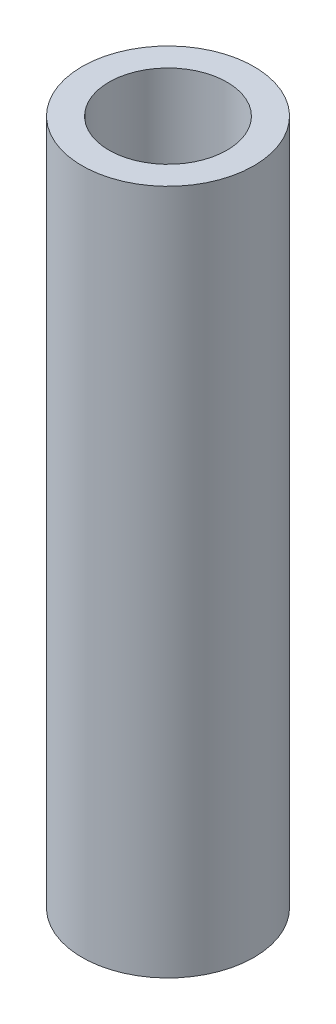
ISO-10303-21;
HEADER;
FILE_DESCRIPTION(('STEP AP214'),'2;1');
FILE_NAME('part.step','',(''),(''),'','','');
FILE_SCHEMA(('AUTOMOTIVE_DESIGN { 1 0 10303 214 1 1 1 1 }'));
ENDSEC;
DATA;
#1=APPLICATION_CONTEXT('core data for automotive mechanical design processes');
#2=APPLICATION_PROTOCOL_DEFINITION('international standard','automotive_design',2000,#1);
#3=PRODUCT_CONTEXT('',#1,'mechanical');
#4=PRODUCT('Part','Part','',(#3));
#5=PRODUCT_RELATED_PRODUCT_CATEGORY('part','',(#4));
#6=PRODUCT_DEFINITION_FORMATION('','',#4);
#7=PRODUCT_DEFINITION_CONTEXT('part definition',#1,'design');
#8=PRODUCT_DEFINITION('design','',#6,#7);
#9=PRODUCT_DEFINITION_SHAPE('','',#8);
#10=(LENGTH_UNIT() NAMED_UNIT(*) SI_UNIT(.MILLI.,.METRE.));
#11=(NAMED_UNIT(*) PLANE_ANGLE_UNIT() SI_UNIT($,.RADIAN.));
#12=(NAMED_UNIT(*) SI_UNIT($,.STERADIAN.) SOLID_ANGLE_UNIT());
#13=UNCERTAINTY_MEASURE_WITH_UNIT(LENGTH_MEASURE(1.E-05),#10,'distance_accuracy_value','');
#14=(GEOMETRIC_REPRESENTATION_CONTEXT(3) GLOBAL_UNCERTAINTY_ASSIGNED_CONTEXT((#13)) GLOBAL_UNIT_ASSIGNED_CONTEXT((#10,
#11,#12)) REPRESENTATION_CONTEXT('',''));
#15=CARTESIAN_POINT('',(0.,0.,0.));
#16=DIRECTION('',(0.,0.,1.));
#17=DIRECTION('',(1.,0.,0.));
#18=AXIS2_PLACEMENT_3D('',#15,#16,#17);
#19=CARTESIAN_POINT('',(0.,70.,0.));
#20=DIRECTION('',(0.,1.,0.));
#21=DIRECTION('',(0.,0.,1.));
#22=AXIS2_PLACEMENT_3D('',#19,#20,#21);
#23=PLANE('',#22);
#24=CARTESIAN_POINT('',(0.,70.,0.));
#25=DIRECTION('',(0.,1.,0.));
#26=DIRECTION('',(1.,0.,0.));
#27=AXIS2_PLACEMENT_3D('',#24,#25,#26);
#28=CIRCLE('',#27,8.775);
#29=CARTESIAN_POINT('',(8.775,70.,0.));
#30=VERTEX_POINT('',#29);
#31=EDGE_CURVE('E11',#30,#30,#28,.T.);
#32=ORIENTED_EDGE('',*,*,#31,.T.);
#33=EDGE_LOOP('',(#32));
#34=FACE_BOUND('',#33,.T.);
#35=CARTESIAN_POINT('',(0.,70.,0.));
#36=DIRECTION('',(0.,1.,0.));
#37=DIRECTION('',(0.,0.,1.));
#38=AXIS2_PLACEMENT_3D('',#35,#36,#37);
#39=CIRCLE('',#38,6.025);
#40=CARTESIAN_POINT('',(0.,70.,6.025));
#41=VERTEX_POINT('',#40);
#42=EDGE_CURVE('E62',#41,#41,#39,.T.);
#43=ORIENTED_EDGE('',*,*,#42,.F.);
#44=EDGE_LOOP('',(#43));
#45=FACE_BOUND('',#44,.T.);
#46=ADVANCED_FACE('F49',(#34,#45),#23,.T.);
#47=CARTESIAN_POINT('',(0.,0.,0.));
#48=DIRECTION('',(0.,1.,0.));
#49=DIRECTION('',(0.,0.,1.));
#50=AXIS2_PLACEMENT_3D('',#47,#48,#49);
#51=PLANE('',#50);
#52=CARTESIAN_POINT('',(0.,0.,0.));
#53=DIRECTION('',(0.,1.,0.));
#54=DIRECTION('',(1.,0.,0.));
#55=AXIS2_PLACEMENT_3D('',#52,#53,#54);
#56=CIRCLE('',#55,8.775);
#57=CARTESIAN_POINT('',(8.775,0.,0.));
#58=VERTEX_POINT('',#57);
#59=EDGE_CURVE('E53',#58,#58,#56,.T.);
#60=ORIENTED_EDGE('',*,*,#59,.F.);
#61=EDGE_LOOP('',(#60));
#62=FACE_BOUND('',#61,.T.);
#63=CARTESIAN_POINT('',(0.,0.,0.));
#64=DIRECTION('',(0.,1.,0.));
#65=DIRECTION('',(0.,0.,1.));
#66=AXIS2_PLACEMENT_3D('',#63,#64,#65);
#67=CIRCLE('',#66,6.025);
#68=CARTESIAN_POINT('',(0.,0.,6.025));
#69=VERTEX_POINT('',#68);
#70=EDGE_CURVE('E64',#69,#69,#67,.T.);
#71=ORIENTED_EDGE('',*,*,#70,.T.);
#72=EDGE_LOOP('',(#71));
#73=FACE_BOUND('',#72,.T.);
#74=ADVANCED_FACE('F76',(#62,#73),#51,.F.);
#75=CARTESIAN_POINT('',(0.,70.,0.));
#76=DIRECTION('',(0.,-1.,0.));
#77=DIRECTION('',(0.,0.,-1.));
#78=AXIS2_PLACEMENT_3D('',#75,#76,#77);
#79=CYLINDRICAL_SURFACE('',#78,8.775);
#80=ORIENTED_EDGE('',*,*,#31,.F.);
#81=EDGE_LOOP('',(#80));
#82=FACE_BOUND('',#81,.T.);
#83=ORIENTED_EDGE('',*,*,#59,.T.);
#84=EDGE_LOOP('',(#83));
#85=FACE_BOUND('',#84,.T.);
#86=ADVANCED_FACE('F51',(#82,#85),#79,.T.);
#87=CARTESIAN_POINT('',(0.,70.,0.));
#88=DIRECTION('',(0.,-1.,0.));
#89=DIRECTION('',(0.,0.,-1.));
#90=AXIS2_PLACEMENT_3D('',#87,#88,#89);
#91=CYLINDRICAL_SURFACE('',#90,6.025);
#92=ORIENTED_EDGE('',*,*,#42,.T.);
#93=EDGE_LOOP('',(#92));
#94=FACE_BOUND('',#93,.T.);
#95=ORIENTED_EDGE('',*,*,#70,.F.);
#96=EDGE_LOOP('',(#95));
#97=FACE_BOUND('',#96,.T.);
#98=ADVANCED_FACE('F72',(#94,#97),#91,.F.);
#99=CLOSED_SHELL('',(#46,#74,#86,#98));
#100=MANIFOLD_SOLID_BREP('B2',#99);
#101=ADVANCED_BREP_SHAPE_REPRESENTATION('',(#18,#100),#14);
#102=SHAPE_DEFINITION_REPRESENTATION(#9,#101);
ENDSEC;
END-ISO-10303-21;
